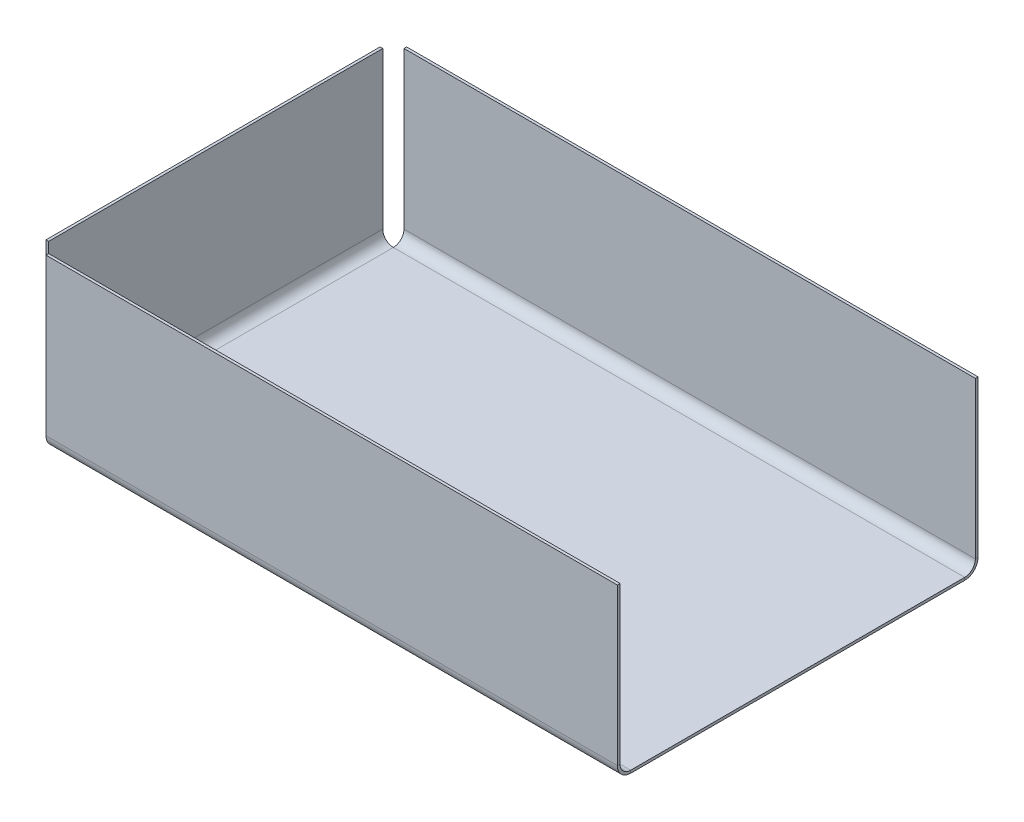
ISO-10303-21;
HEADER;
FILE_DESCRIPTION(('STEP AP214'),'2;1');
FILE_NAME('part.step','',(''),(''),'','','');
FILE_SCHEMA(('AUTOMOTIVE_DESIGN { 1 0 10303 214 1 1 1 1 }'));
ENDSEC;
DATA;
#1=APPLICATION_CONTEXT('core data for automotive mechanical design processes');
#2=APPLICATION_PROTOCOL_DEFINITION('international standard','automotive_design',2000,#1);
#3=PRODUCT_CONTEXT('',#1,'mechanical');
#4=PRODUCT('Part','Part','',(#3));
#5=PRODUCT_RELATED_PRODUCT_CATEGORY('part','',(#4));
#6=PRODUCT_DEFINITION_FORMATION('','',#4);
#7=PRODUCT_DEFINITION_CONTEXT('part definition',#1,'design');
#8=PRODUCT_DEFINITION('design','',#6,#7);
#9=PRODUCT_DEFINITION_SHAPE('','',#8);
#10=(LENGTH_UNIT() NAMED_UNIT(*) SI_UNIT(.MILLI.,.METRE.));
#11=(NAMED_UNIT(*) PLANE_ANGLE_UNIT() SI_UNIT($,.RADIAN.));
#12=(NAMED_UNIT(*) SI_UNIT($,.STERADIAN.) SOLID_ANGLE_UNIT());
#13=UNCERTAINTY_MEASURE_WITH_UNIT(LENGTH_MEASURE(1.E-05),#10,'distance_accuracy_value','');
#14=(GEOMETRIC_REPRESENTATION_CONTEXT(3) GLOBAL_UNCERTAINTY_ASSIGNED_CONTEXT((#13)) GLOBAL_UNIT_ASSIGNED_CONTEXT((#10,
#11,#12)) REPRESENTATION_CONTEXT('',''));
#15=CARTESIAN_POINT('',(0.,0.,0.));
#16=DIRECTION('',(0.,0.,1.));
#17=DIRECTION('',(1.,0.,0.));
#18=AXIS2_PLACEMENT_3D('',#15,#16,#17);
#19=CARTESIAN_POINT('',(0.,-1.6002,0.));
#20=DIRECTION('',(0.,1.,0.));
#21=DIRECTION('',(0.,0.,1.));
#22=AXIS2_PLACEMENT_3D('',#19,#20,#21);
#23=PLANE('',#22);
#24=DIRECTION('',(0.,0.,1.));
#25=VECTOR('',#24,1.);
#26=CARTESIAN_POINT('',(-167.0498,-1.6002,100.));
#27=LINE('',#26,#25);
#28=CARTESIAN_POINT('',(-167.0498,-1.6002,100.));
#29=VERTEX_POINT('',#28);
#30=CARTESIAN_POINT('',(-167.0498,-1.60020000000004,-100.));
#31=VERTEX_POINT('',#30);
#32=EDGE_CURVE('E212',#29,#31,#27,.F.);
#33=ORIENTED_EDGE('',*,*,#32,.T.);
#34=DIRECTION('',(-1.,0.,0.));
#35=VECTOR('',#34,1.);
#36=CARTESIAN_POINT('',(-175.,-1.6002,-100.));
#37=LINE('',#36,#35);
#38=CARTESIAN_POINT('',(175.,-1.6002,-100.));
#39=VERTEX_POINT('',#38);
#40=EDGE_CURVE('E130',#39,#31,#37,.T.);
#41=ORIENTED_EDGE('',*,*,#40,.F.);
#42=DIRECTION('',(0.,0.,-1.));
#43=VECTOR('',#42,1.);
#44=CARTESIAN_POINT('',(175.,-1.6002,-100.));
#45=LINE('',#44,#43);
#46=CARTESIAN_POINT('',(175.,-1.60020000000003,100.));
#47=VERTEX_POINT('',#46);
#48=EDGE_CURVE('E226',#47,#39,#45,.T.);
#49=ORIENTED_EDGE('',*,*,#48,.F.);
#50=DIRECTION('',(1.,0.,0.));
#51=VECTOR('',#50,1.);
#52=CARTESIAN_POINT('',(-175.,-1.6002,100.));
#53=LINE('',#52,#51);
#54=EDGE_CURVE('E149',#29,#47,#53,.T.);
#55=ORIENTED_EDGE('',*,*,#54,.F.);
#56=EDGE_LOOP('',(#33,#41,#49,#55));
#57=FACE_BOUND('',#56,.T.);
#58=ADVANCED_FACE('F106',(#57),#23,.F.);
#59=CARTESIAN_POINT('',(0.,0.,0.));
#60=DIRECTION('',(0.,1.,0.));
#61=DIRECTION('',(0.,0.,1.));
#62=AXIS2_PLACEMENT_3D('',#59,#60,#61);
#63=PLANE('',#62);
#64=DIRECTION('',(-1.,0.,0.));
#65=VECTOR('',#64,1.);
#66=CARTESIAN_POINT('',(-175.,0.,-100.));
#67=LINE('',#66,#65);
#68=CARTESIAN_POINT('',(175.,0.,-100.));
#69=VERTEX_POINT('',#68);
#70=CARTESIAN_POINT('',(-167.0498,0.,-100.));
#71=VERTEX_POINT('',#70);
#72=EDGE_CURVE('E144',#69,#71,#67,.T.);
#73=ORIENTED_EDGE('',*,*,#72,.T.);
#74=DIRECTION('',(0.,0.,1.));
#75=VECTOR('',#74,1.);
#76=CARTESIAN_POINT('',(-167.0498,0.,100.));
#77=LINE('',#76,#75);
#78=CARTESIAN_POINT('',(-167.0498,0.,100.));
#79=VERTEX_POINT('',#78);
#80=EDGE_CURVE('E121',#79,#71,#77,.F.);
#81=ORIENTED_EDGE('',*,*,#80,.F.);
#82=DIRECTION('',(1.,0.,0.));
#83=VECTOR('',#82,1.);
#84=CARTESIAN_POINT('',(-175.,0.,100.));
#85=LINE('',#84,#83);
#86=CARTESIAN_POINT('',(175.,0.,100.));
#87=VERTEX_POINT('',#86);
#88=EDGE_CURVE('E228',#79,#87,#85,.T.);
#89=ORIENTED_EDGE('',*,*,#88,.T.);
#90=DIRECTION('',(0.,0.,-1.));
#91=VECTOR('',#90,1.);
#92=CARTESIAN_POINT('',(175.,0.,-100.));
#93=LINE('',#92,#91);
#94=EDGE_CURVE('E224',#87,#69,#93,.T.);
#95=ORIENTED_EDGE('',*,*,#94,.T.);
#96=EDGE_LOOP('',(#73,#81,#89,#95));
#97=FACE_BOUND('',#96,.T.);
#98=ADVANCED_FACE('F233',(#97),#63,.T.);
#99=CARTESIAN_POINT('',(175.,-1.6002,-100.));
#100=DIRECTION('',(1.,0.,0.));
#101=DIRECTION('',(0.,0.,-1.));
#102=AXIS2_PLACEMENT_3D('',#99,#100,#101);
#103=PLANE('',#102);
#104=ORIENTED_EDGE('',*,*,#94,.F.);
#105=DIRECTION('',(0.,1.,0.));
#106=VECTOR('',#105,1.);
#107=CARTESIAN_POINT('',(175.,-1.6002,100.));
#108=LINE('',#107,#106);
#109=EDGE_CURVE('E13',#47,#87,#108,.T.);
#110=ORIENTED_EDGE('',*,*,#109,.F.);
#111=ORIENTED_EDGE('',*,*,#48,.T.);
#112=DIRECTION('',(0.,1.,0.));
#113=VECTOR('',#112,1.);
#114=CARTESIAN_POINT('',(175.,-1.6002,-100.));
#115=LINE('',#114,#113);
#116=EDGE_CURVE('E110',#39,#69,#115,.T.);
#117=ORIENTED_EDGE('',*,*,#116,.T.);
#118=EDGE_LOOP('',(#104,#110,#111,#117));
#119=FACE_BOUND('',#118,.T.);
#120=ADVANCED_FACE('F108',(#119),#103,.T.);
#121=CARTESIAN_POINT('',(-167.0498,6.34999999999999,-100.));
#122=DIRECTION('',(0.,0.,-1.));
#123=DIRECTION('',(-1.,0.,0.));
#124=AXIS2_PLACEMENT_3D('',#121,#122,#123);
#125=PLANE('',#124);
#126=DIRECTION('',(-1.,0.,0.));
#127=VECTOR('',#126,1.);
#128=CARTESIAN_POINT('',(-175.,6.34999999999997,-100.));
#129=LINE('',#128,#127);
#130=CARTESIAN_POINT('',(-173.3998,6.34999999999997,-100.));
#131=VERTEX_POINT('',#130);
#132=CARTESIAN_POINT('',(-175.,6.34999999999996,-100.));
#133=VERTEX_POINT('',#132);
#134=EDGE_CURVE('E176',#131,#133,#129,.T.);
#135=ORIENTED_EDGE('',*,*,#134,.F.);
#136=CARTESIAN_POINT('',(-167.0498,6.34999999999999,-100.));
#137=DIRECTION('',(0.,0.,1.));
#138=DIRECTION('',(1.,0.,0.));
#139=AXIS2_PLACEMENT_3D('',#136,#137,#138);
#140=CIRCLE('',#139,6.34999999999999);
#141=EDGE_CURVE('E170',#71,#131,#140,.F.);
#142=ORIENTED_EDGE('',*,*,#141,.F.);
#143=DIRECTION('',(0.,-1.,0.));
#144=VECTOR('',#143,1.);
#145=CARTESIAN_POINT('',(-167.0498,0.,-100.));
#146=LINE('',#145,#144);
#147=EDGE_CURVE('E221',#71,#31,#146,.T.);
#148=ORIENTED_EDGE('',*,*,#147,.T.);
#149=CARTESIAN_POINT('',(-167.0498,6.34999999999999,-100.));
#150=DIRECTION('',(0.,0.,1.));
#151=DIRECTION('',(1.,0.,0.));
#152=AXIS2_PLACEMENT_3D('',#149,#150,#151);
#153=CIRCLE('',#152,7.95019999999999);
#154=EDGE_CURVE('E214',#31,#133,#153,.F.);
#155=ORIENTED_EDGE('',*,*,#154,.T.);
#156=EDGE_LOOP('',(#135,#142,#148,#155));
#157=FACE_BOUND('',#156,.T.);
#158=ADVANCED_FACE('F465',(#157),#125,.T.);
#159=CARTESIAN_POINT('',(-167.0498,6.34999999999999,100.));
#160=DIRECTION('',(0.,0.,-1.));
#161=DIRECTION('',(-1.,0.,0.));
#162=AXIS2_PLACEMENT_3D('',#159,#160,#161);
#163=PLANE('',#162);
#164=CARTESIAN_POINT('',(-167.0498,6.34999999999999,100.));
#165=DIRECTION('',(0.,0.,1.));
#166=DIRECTION('',(1.,0.,0.));
#167=AXIS2_PLACEMENT_3D('',#164,#165,#166);
#168=CIRCLE('',#167,6.34999999999999);
#169=CARTESIAN_POINT('',(-173.3998,6.34999999999997,100.));
#170=VERTEX_POINT('',#169);
#171=EDGE_CURVE('E167',#170,#79,#168,.T.);
#172=ORIENTED_EDGE('',*,*,#171,.F.);
#173=DIRECTION('',(-1.,0.,0.));
#174=VECTOR('',#173,1.);
#175=CARTESIAN_POINT('',(-173.3998,6.34999999999997,100.));
#176=LINE('',#175,#174);
#177=CARTESIAN_POINT('',(-175.,6.34999999999996,100.));
#178=VERTEX_POINT('',#177);
#179=EDGE_CURVE('E175',#170,#178,#176,.T.);
#180=ORIENTED_EDGE('',*,*,#179,.T.);
#181=CARTESIAN_POINT('',(-167.0498,6.34999999999999,100.));
#182=DIRECTION('',(0.,0.,1.));
#183=DIRECTION('',(1.,0.,0.));
#184=AXIS2_PLACEMENT_3D('',#181,#182,#183);
#185=CIRCLE('',#184,7.95019999999999);
#186=EDGE_CURVE('E215',#178,#29,#185,.T.);
#187=ORIENTED_EDGE('',*,*,#186,.T.);
#188=DIRECTION('',(0.,-1.,0.));
#189=VECTOR('',#188,1.);
#190=CARTESIAN_POINT('',(-167.0498,0.,100.));
#191=LINE('',#190,#189);
#192=EDGE_CURVE('E185',#79,#29,#191,.T.);
#193=ORIENTED_EDGE('',*,*,#192,.F.);
#194=EDGE_LOOP('',(#172,#180,#187,#193));
#195=FACE_BOUND('',#194,.T.);
#196=ADVANCED_FACE('F180',(#195),#163,.F.);
#197=CARTESIAN_POINT('',(-167.0498,6.34999999999999,100.));
#198=DIRECTION('',(0.,0.,1.));
#199=DIRECTION('',(-1.,0.,0.));
#200=AXIS2_PLACEMENT_3D('',#197,#198,#199);
#201=CYLINDRICAL_SURFACE('',#200,7.95019999999999);
#202=ORIENTED_EDGE('',*,*,#32,.F.);
#203=ORIENTED_EDGE('',*,*,#186,.F.);
#204=DIRECTION('',(0.,0.,1.));
#205=VECTOR('',#204,1.);
#206=CARTESIAN_POINT('',(-175.,6.34999999999996,0.));
#207=LINE('',#206,#205);
#208=EDGE_CURVE('E203',#133,#178,#207,.T.);
#209=ORIENTED_EDGE('',*,*,#208,.F.);
#210=ORIENTED_EDGE('',*,*,#154,.F.);
#211=EDGE_LOOP('',(#202,#203,#209,#210));
#212=FACE_BOUND('',#211,.T.);
#213=ADVANCED_FACE('F464',(#212),#201,.T.);
#214=CARTESIAN_POINT('',(-167.0498,6.34999999999999,100.));
#215=DIRECTION('',(0.,0.,1.));
#216=DIRECTION('',(-1.,0.,0.));
#217=AXIS2_PLACEMENT_3D('',#214,#215,#216);
#218=CYLINDRICAL_SURFACE('',#217,6.34999999999999);
#219=ORIENTED_EDGE('',*,*,#80,.T.);
#220=ORIENTED_EDGE('',*,*,#141,.T.);
#221=DIRECTION('',(0.,0.,-1.));
#222=VECTOR('',#221,1.);
#223=CARTESIAN_POINT('',(-173.3998,6.34999999999997,-100.));
#224=LINE('',#223,#222);
#225=EDGE_CURVE('E164',#131,#170,#224,.F.);
#226=ORIENTED_EDGE('',*,*,#225,.T.);
#227=ORIENTED_EDGE('',*,*,#171,.T.);
#228=EDGE_LOOP('',(#219,#220,#226,#227));
#229=FACE_BOUND('',#228,.T.);
#230=ADVANCED_FACE('F166',(#229),#218,.F.);
#231=CARTESIAN_POINT('',(-175.,0.,100.));
#232=DIRECTION('',(0.,0.,1.));
#233=DIRECTION('',(1.,0.,0.));
#234=AXIS2_PLACEMENT_3D('',#231,#232,#233);
#235=PLANE('',#234);
#236=DIRECTION('',(0.,-1.,0.));
#237=VECTOR('',#236,1.);
#238=CARTESIAN_POINT('',(-175.,0.,100.));
#239=LINE('',#238,#237);
#240=CARTESIAN_POINT('',(-175.,100.,100.));
#241=VERTEX_POINT('',#240);
#242=EDGE_CURVE('E202',#241,#178,#239,.T.);
#243=ORIENTED_EDGE('',*,*,#242,.T.);
#244=ORIENTED_EDGE('',*,*,#179,.F.);
#245=DIRECTION('',(0.,1.,0.));
#246=VECTOR('',#245,1.);
#247=CARTESIAN_POINT('',(-173.3998,-6.31439345255558E-13,100.));
#248=LINE('',#247,#246);
#249=CARTESIAN_POINT('',(-173.3998,100.,100.));
#250=VERTEX_POINT('',#249);
#251=EDGE_CURVE('E190',#250,#170,#248,.F.);
#252=ORIENTED_EDGE('',*,*,#251,.F.);
#253=DIRECTION('',(1.,0.,0.));
#254=VECTOR('',#253,1.);
#255=CARTESIAN_POINT('',(-175.,100.,100.));
#256=LINE('',#255,#254);
#257=EDGE_CURVE('E186',#241,#250,#256,.T.);
#258=ORIENTED_EDGE('',*,*,#257,.F.);
#259=EDGE_LOOP('',(#243,#244,#252,#258));
#260=FACE_BOUND('',#259,.T.);
#261=ADVANCED_FACE('F200',(#260),#235,.T.);
#262=CARTESIAN_POINT('',(-175.,100.,-100.));
#263=DIRECTION('',(0.,0.,-1.));
#264=DIRECTION('',(-1.,0.,0.));
#265=AXIS2_PLACEMENT_3D('',#262,#263,#264);
#266=PLANE('',#265);
#267=DIRECTION('',(0.,-1.,0.));
#268=VECTOR('',#267,1.);
#269=CARTESIAN_POINT('',(-173.3998,-6.31439345255558E-13,-100.));
#270=LINE('',#269,#268);
#271=CARTESIAN_POINT('',(-173.3998,100.,-100.));
#272=VERTEX_POINT('',#271);
#273=EDGE_CURVE('E205',#131,#272,#270,.F.);
#274=ORIENTED_EDGE('',*,*,#273,.F.);
#275=ORIENTED_EDGE('',*,*,#134,.T.);
#276=DIRECTION('',(0.,1.,0.));
#277=VECTOR('',#276,1.);
#278=CARTESIAN_POINT('',(-175.,100.,-100.));
#279=LINE('',#278,#277);
#280=CARTESIAN_POINT('',(-175.,100.,-100.));
#281=VERTEX_POINT('',#280);
#282=EDGE_CURVE('E197',#133,#281,#279,.T.);
#283=ORIENTED_EDGE('',*,*,#282,.T.);
#284=DIRECTION('',(1.,0.,0.));
#285=VECTOR('',#284,1.);
#286=CARTESIAN_POINT('',(-175.,100.,-100.));
#287=LINE('',#286,#285);
#288=EDGE_CURVE('E265',#281,#272,#287,.T.);
#289=ORIENTED_EDGE('',*,*,#288,.T.);
#290=EDGE_LOOP('',(#274,#275,#283,#289));
#291=FACE_BOUND('',#290,.T.);
#292=ADVANCED_FACE('F277',(#291),#266,.T.);
#293=CARTESIAN_POINT('',(-175.,-6.37026413693975E-13,0.));
#294=DIRECTION('',(-1.,0.,0.));
#295=DIRECTION('',(0.,-1.,0.));
#296=AXIS2_PLACEMENT_3D('',#293,#294,#295);
#297=PLANE('',#296);
#298=ORIENTED_EDGE('',*,*,#282,.F.);
#299=ORIENTED_EDGE('',*,*,#208,.T.);
#300=ORIENTED_EDGE('',*,*,#242,.F.);
#301=DIRECTION('',(0.,0.,1.));
#302=VECTOR('',#301,1.);
#303=CARTESIAN_POINT('',(-175.,100.,100.));
#304=LINE('',#303,#302);
#305=EDGE_CURVE('E269',#281,#241,#304,.T.);
#306=ORIENTED_EDGE('',*,*,#305,.F.);
#307=EDGE_LOOP('',(#298,#299,#300,#306));
#308=FACE_BOUND('',#307,.T.);
#309=ADVANCED_FACE('F476',(#308),#297,.T.);
#310=CARTESIAN_POINT('',(-173.3998,-6.31439345255558E-13,0.));
#311=DIRECTION('',(-1.,0.,0.));
#312=DIRECTION('',(0.,-1.,0.));
#313=AXIS2_PLACEMENT_3D('',#310,#311,#312);
#314=PLANE('',#313);
#315=ORIENTED_EDGE('',*,*,#225,.F.);
#316=ORIENTED_EDGE('',*,*,#273,.T.);
#317=DIRECTION('',(0.,0.,-1.));
#318=VECTOR('',#317,1.);
#319=CARTESIAN_POINT('',(-173.3998,100.,0.));
#320=LINE('',#319,#318);
#321=EDGE_CURVE('E194',#272,#250,#320,.F.);
#322=ORIENTED_EDGE('',*,*,#321,.T.);
#323=ORIENTED_EDGE('',*,*,#251,.T.);
#324=EDGE_LOOP('',(#315,#316,#322,#323));
#325=FACE_BOUND('',#324,.T.);
#326=ADVANCED_FACE('F191',(#325),#314,.F.);
#327=CARTESIAN_POINT('',(-175.,100.,100.));
#328=DIRECTION('',(0.,1.,0.));
#329=DIRECTION('',(-1.,0.,0.));
#330=AXIS2_PLACEMENT_3D('',#327,#328,#329);
#331=PLANE('',#330);
#332=ORIENTED_EDGE('',*,*,#321,.F.);
#333=ORIENTED_EDGE('',*,*,#288,.F.);
#334=ORIENTED_EDGE('',*,*,#305,.T.);
#335=ORIENTED_EDGE('',*,*,#257,.T.);
#336=EDGE_LOOP('',(#332,#333,#334,#335));
#337=FACE_BOUND('',#336,.T.);
#338=ADVANCED_FACE('F282',(#337),#331,.T.);
#339=CARTESIAN_POINT('',(-167.0498,6.34999999999998,100.));
#340=DIRECTION('',(-1.,0.,0.));
#341=DIRECTION('',(0.,0.,1.));
#342=AXIS2_PLACEMENT_3D('',#339,#340,#341);
#343=PLANE('',#342);
#344=DIRECTION('',(0.,0.,1.));
#345=VECTOR('',#344,1.);
#346=CARTESIAN_POINT('',(-167.0498,6.34999999999998,107.9502));
#347=LINE('',#346,#345);
#348=CARTESIAN_POINT('',(-167.0498,6.34999999999996,106.35));
#349=VERTEX_POINT('',#348);
#350=CARTESIAN_POINT('',(-167.0498,6.34999999999995,107.9502));
#351=VERTEX_POINT('',#350);
#352=EDGE_CURVE('E387',#349,#351,#347,.T.);
#353=ORIENTED_EDGE('',*,*,#352,.F.);
#354=CARTESIAN_POINT('',(-167.0498,6.34999999999998,100.));
#355=DIRECTION('',(1.,0.,0.));
#356=DIRECTION('',(0.,0.,-1.));
#357=AXIS2_PLACEMENT_3D('',#354,#355,#356);
#358=CIRCLE('',#357,6.35000000000001);
#359=EDGE_CURVE('E254',#79,#349,#358,.F.);
#360=ORIENTED_EDGE('',*,*,#359,.F.);
#361=ORIENTED_EDGE('',*,*,#192,.T.);
#362=CARTESIAN_POINT('',(-167.0498,6.34999999999998,100.));
#363=DIRECTION('',(1.,0.,0.));
#364=DIRECTION('',(0.,0.,-1.));
#365=AXIS2_PLACEMENT_3D('',#362,#363,#364);
#366=CIRCLE('',#365,7.95020000000001);
#367=EDGE_CURVE('E211',#29,#351,#366,.F.);
#368=ORIENTED_EDGE('',*,*,#367,.T.);
#369=EDGE_LOOP('',(#353,#360,#361,#368));
#370=FACE_BOUND('',#369,.T.);
#371=ADVANCED_FACE('F424',(#370),#343,.T.);
#372=CARTESIAN_POINT('',(175.,6.34999999999998,100.));
#373=DIRECTION('',(-1.,0.,0.));
#374=DIRECTION('',(0.,0.,1.));
#375=AXIS2_PLACEMENT_3D('',#372,#373,#374);
#376=PLANE('',#375);
#377=CARTESIAN_POINT('',(175.,6.34999999999998,100.));
#378=DIRECTION('',(1.,0.,0.));
#379=DIRECTION('',(0.,0.,-1.));
#380=AXIS2_PLACEMENT_3D('',#377,#378,#379);
#381=CIRCLE('',#380,6.35000000000001);
#382=CARTESIAN_POINT('',(175.,6.34999999999996,106.35));
#383=VERTEX_POINT('',#382);
#384=EDGE_CURVE('E246',#383,#87,#381,.T.);
#385=ORIENTED_EDGE('',*,*,#384,.F.);
#386=DIRECTION('',(0.,0.,1.));
#387=VECTOR('',#386,1.);
#388=CARTESIAN_POINT('',(175.,6.34999999999998,106.35));
#389=LINE('',#388,#387);
#390=CARTESIAN_POINT('',(175.,6.34999999999998,107.9502));
#391=VERTEX_POINT('',#390);
#392=EDGE_CURVE('E416',#383,#391,#389,.T.);
#393=ORIENTED_EDGE('',*,*,#392,.T.);
#394=CARTESIAN_POINT('',(175.,6.34999999999998,100.));
#395=DIRECTION('',(1.,0.,0.));
#396=DIRECTION('',(0.,0.,-1.));
#397=AXIS2_PLACEMENT_3D('',#394,#395,#396);
#398=CIRCLE('',#397,7.95020000000001);
#399=EDGE_CURVE('E249',#391,#47,#398,.T.);
#400=ORIENTED_EDGE('',*,*,#399,.T.);
#401=ORIENTED_EDGE('',*,*,#109,.T.);
#402=EDGE_LOOP('',(#385,#393,#400,#401));
#403=FACE_BOUND('',#402,.T.);
#404=ADVANCED_FACE('F243',(#403),#376,.F.);
#405=CARTESIAN_POINT('',(175.,6.34999999999998,100.));
#406=DIRECTION('',(1.,0.,0.));
#407=DIRECTION('',(0.,0.,1.));
#408=AXIS2_PLACEMENT_3D('',#405,#406,#407);
#409=CYLINDRICAL_SURFACE('',#408,7.95020000000001);
#410=ORIENTED_EDGE('',*,*,#54,.T.);
#411=ORIENTED_EDGE('',*,*,#399,.F.);
#412=DIRECTION('',(1.,0.,0.));
#413=VECTOR('',#412,1.);
#414=CARTESIAN_POINT('',(0.,6.34999999999998,107.9502));
#415=LINE('',#414,#413);
#416=EDGE_CURVE('E413',#351,#391,#415,.T.);
#417=ORIENTED_EDGE('',*,*,#416,.F.);
#418=ORIENTED_EDGE('',*,*,#367,.F.);
#419=EDGE_LOOP('',(#410,#411,#417,#418));
#420=FACE_BOUND('',#419,.T.);
#421=ADVANCED_FACE('F451',(#420),#409,.T.);
#422=CARTESIAN_POINT('',(175.,6.34999999999998,100.));
#423=DIRECTION('',(1.,0.,0.));
#424=DIRECTION('',(0.,0.,1.));
#425=AXIS2_PLACEMENT_3D('',#422,#423,#424);
#426=CYLINDRICAL_SURFACE('',#425,6.35000000000001);
#427=ORIENTED_EDGE('',*,*,#88,.F.);
#428=ORIENTED_EDGE('',*,*,#359,.T.);
#429=DIRECTION('',(-1.,0.,0.));
#430=VECTOR('',#429,1.);
#431=CARTESIAN_POINT('',(-167.0498,6.34999999999998,106.35));
#432=LINE('',#431,#430);
#433=EDGE_CURVE('E253',#349,#383,#432,.F.);
#434=ORIENTED_EDGE('',*,*,#433,.T.);
#435=ORIENTED_EDGE('',*,*,#384,.T.);
#436=EDGE_LOOP('',(#427,#428,#434,#435));
#437=FACE_BOUND('',#436,.T.);
#438=ADVANCED_FACE('F251',(#437),#426,.F.);
#439=CARTESIAN_POINT('',(175.,0.,107.9502));
#440=DIRECTION('',(1.,0.,0.));
#441=DIRECTION('',(0.,0.,-1.));
#442=AXIS2_PLACEMENT_3D('',#439,#440,#441);
#443=PLANE('',#442);
#444=DIRECTION('',(0.,-1.,0.));
#445=VECTOR('',#444,1.);
#446=CARTESIAN_POINT('',(175.,0.,107.9502));
#447=LINE('',#446,#445);
#448=CARTESIAN_POINT('',(175.,100.,107.9502));
#449=VERTEX_POINT('',#448);
#450=EDGE_CURVE('E398',#449,#391,#447,.T.);
#451=ORIENTED_EDGE('',*,*,#450,.T.);
#452=ORIENTED_EDGE('',*,*,#392,.F.);
#453=DIRECTION('',(0.,1.,0.));
#454=VECTOR('',#453,1.);
#455=CARTESIAN_POINT('',(175.,-3.46944695195361E-13,106.35));
#456=LINE('',#455,#454);
#457=CARTESIAN_POINT('',(175.,100.,106.35));
#458=VERTEX_POINT('',#457);
#459=EDGE_CURVE('E406',#458,#383,#456,.F.);
#460=ORIENTED_EDGE('',*,*,#459,.F.);
#461=DIRECTION('',(0.,0.,-1.));
#462=VECTOR('',#461,1.);
#463=CARTESIAN_POINT('',(175.,100.,107.9502));
#464=LINE('',#463,#462);
#465=EDGE_CURVE('E255',#449,#458,#464,.T.);
#466=ORIENTED_EDGE('',*,*,#465,.F.);
#467=EDGE_LOOP('',(#451,#452,#460,#466));
#468=FACE_BOUND('',#467,.T.);
#469=ADVANCED_FACE('F443',(#468),#443,.T.);
#470=CARTESIAN_POINT('',(-167.0498,100.,107.9502));
#471=DIRECTION('',(-1.,0.,0.));
#472=DIRECTION('',(0.,0.,1.));
#473=AXIS2_PLACEMENT_3D('',#470,#471,#472);
#474=PLANE('',#473);
#475=DIRECTION('',(0.,-1.,0.));
#476=VECTOR('',#475,1.);
#477=CARTESIAN_POINT('',(-167.0498,-3.46944695195361E-13,106.35));
#478=LINE('',#477,#476);
#479=CARTESIAN_POINT('',(-167.0498,100.,106.35));
#480=VERTEX_POINT('',#479);
#481=EDGE_CURVE('E411',#349,#480,#478,.F.);
#482=ORIENTED_EDGE('',*,*,#481,.F.);
#483=ORIENTED_EDGE('',*,*,#352,.T.);
#484=DIRECTION('',(0.,1.,0.));
#485=VECTOR('',#484,1.);
#486=CARTESIAN_POINT('',(-167.0498,100.,107.9502));
#487=LINE('',#486,#485);
#488=CARTESIAN_POINT('',(-167.0498,100.,107.9502));
#489=VERTEX_POINT('',#488);
#490=EDGE_CURVE('E404',#351,#489,#487,.T.);
#491=ORIENTED_EDGE('',*,*,#490,.T.);
#492=DIRECTION('',(0.,0.,-1.));
#493=VECTOR('',#492,1.);
#494=CARTESIAN_POINT('',(-167.0498,100.,107.9502));
#495=LINE('',#494,#493);
#496=EDGE_CURVE('E259',#489,#480,#495,.T.);
#497=ORIENTED_EDGE('',*,*,#496,.T.);
#498=EDGE_LOOP('',(#482,#483,#491,#497));
#499=FACE_BOUND('',#498,.T.);
#500=ADVANCED_FACE('F429',(#499),#474,.T.);
#501=CARTESIAN_POINT('',(0.,-3.52531763633778E-13,107.9502));
#502=DIRECTION('',(0.,0.,1.));
#503=DIRECTION('',(0.,-1.,0.));
#504=AXIS2_PLACEMENT_3D('',#501,#502,#503);
#505=PLANE('',#504);
#506=ORIENTED_EDGE('',*,*,#490,.F.);
#507=ORIENTED_EDGE('',*,*,#416,.T.);
#508=ORIENTED_EDGE('',*,*,#450,.F.);
#509=DIRECTION('',(1.,0.,0.));
#510=VECTOR('',#509,1.);
#511=CARTESIAN_POINT('',(175.,100.,107.9502));
#512=LINE('',#511,#510);
#513=EDGE_CURVE('E401',#489,#449,#512,.T.);
#514=ORIENTED_EDGE('',*,*,#513,.F.);
#515=EDGE_LOOP('',(#506,#507,#508,#514));
#516=FACE_BOUND('',#515,.T.);
#517=ADVANCED_FACE('F433',(#516),#505,.T.);
#518=CARTESIAN_POINT('',(0.,-3.46944695195361E-13,106.35));
#519=DIRECTION('',(0.,0.,1.));
#520=DIRECTION('',(0.,-1.,0.));
#521=AXIS2_PLACEMENT_3D('',#518,#519,#520);
#522=PLANE('',#521);
#523=ORIENTED_EDGE('',*,*,#433,.F.);
#524=ORIENTED_EDGE('',*,*,#481,.T.);
#525=DIRECTION('',(-1.,0.,0.));
#526=VECTOR('',#525,1.);
#527=CARTESIAN_POINT('',(0.,100.,106.35));
#528=LINE('',#527,#526);
#529=EDGE_CURVE('E408',#480,#458,#528,.F.);
#530=ORIENTED_EDGE('',*,*,#529,.T.);
#531=ORIENTED_EDGE('',*,*,#459,.T.);
#532=EDGE_LOOP('',(#523,#524,#530,#531));
#533=FACE_BOUND('',#532,.T.);
#534=ADVANCED_FACE('F440',(#533),#522,.F.);
#535=CARTESIAN_POINT('',(175.,100.,107.9502));
#536=DIRECTION('',(0.,1.,0.));
#537=DIRECTION('',(0.,0.,1.));
#538=AXIS2_PLACEMENT_3D('',#535,#536,#537);
#539=PLANE('',#538);
#540=ORIENTED_EDGE('',*,*,#529,.F.);
#541=ORIENTED_EDGE('',*,*,#496,.F.);
#542=ORIENTED_EDGE('',*,*,#513,.T.);
#543=ORIENTED_EDGE('',*,*,#465,.T.);
#544=EDGE_LOOP('',(#540,#541,#542,#543));
#545=FACE_BOUND('',#544,.T.);
#546=ADVANCED_FACE('F437',(#545),#539,.T.);
#547=CARTESIAN_POINT('',(175.,6.34999999999994,-100.));
#548=DIRECTION('',(1.,0.,0.));
#549=DIRECTION('',(0.,0.,-1.));
#550=AXIS2_PLACEMENT_3D('',#547,#548,#549);
#551=PLANE('',#550);
#552=DIRECTION('',(0.,0.,-1.));
#553=VECTOR('',#552,1.);
#554=CARTESIAN_POINT('',(175.,6.34999999999999,-107.9502));
#555=LINE('',#554,#553);
#556=CARTESIAN_POINT('',(175.,6.34999999999994,-106.35));
#557=VERTEX_POINT('',#556);
#558=CARTESIAN_POINT('',(175.,6.34999999999994,-107.9502));
#559=VERTEX_POINT('',#558);
#560=EDGE_CURVE('E381',#557,#559,#555,.T.);
#561=ORIENTED_EDGE('',*,*,#560,.F.);
#562=CARTESIAN_POINT('',(175.,6.34999999999994,-100.));
#563=DIRECTION('',(-1.,0.,0.));
#564=DIRECTION('',(0.,0.,1.));
#565=AXIS2_PLACEMENT_3D('',#562,#563,#564);
#566=CIRCLE('',#565,6.34999999999998);
#567=EDGE_CURVE('E391',#69,#557,#566,.F.);
#568=ORIENTED_EDGE('',*,*,#567,.F.);
#569=ORIENTED_EDGE('',*,*,#116,.F.);
#570=CARTESIAN_POINT('',(175.,6.34999999999994,-100.));
#571=DIRECTION('',(-1.,0.,0.));
#572=DIRECTION('',(0.,0.,1.));
#573=AXIS2_PLACEMENT_3D('',#570,#571,#572);
#574=CIRCLE('',#573,7.95019999999998);
#575=EDGE_CURVE('E384',#39,#559,#574,.F.);
#576=ORIENTED_EDGE('',*,*,#575,.T.);
#577=EDGE_LOOP('',(#561,#568,#569,#576));
#578=FACE_BOUND('',#577,.T.);
#579=ADVANCED_FACE('F491',(#578),#551,.T.);
#580=CARTESIAN_POINT('',(-167.0498,6.34999999999994,-100.));
#581=DIRECTION('',(1.,0.,0.));
#582=DIRECTION('',(0.,0.,-1.));
#583=AXIS2_PLACEMENT_3D('',#580,#581,#582);
#584=PLANE('',#583);
#585=CARTESIAN_POINT('',(-167.0498,6.34999999999994,-100.));
#586=DIRECTION('',(-1.,0.,0.));
#587=DIRECTION('',(0.,0.,1.));
#588=AXIS2_PLACEMENT_3D('',#585,#586,#587);
#589=CIRCLE('',#588,6.34999999999998);
#590=CARTESIAN_POINT('',(-167.0498,6.34999999999994,-106.35));
#591=VERTEX_POINT('',#590);
#592=EDGE_CURVE('E351',#591,#71,#589,.T.);
#593=ORIENTED_EDGE('',*,*,#592,.F.);
#594=DIRECTION('',(0.,0.,-1.));
#595=VECTOR('',#594,1.);
#596=CARTESIAN_POINT('',(-167.0498,6.34999999999998,-106.35));
#597=LINE('',#596,#595);
#598=CARTESIAN_POINT('',(-167.0498,6.34999999999999,-107.9502));
#599=VERTEX_POINT('',#598);
#600=EDGE_CURVE('E376',#591,#599,#597,.T.);
#601=ORIENTED_EDGE('',*,*,#600,.T.);
#602=CARTESIAN_POINT('',(-167.0498,6.34999999999994,-100.));
#603=DIRECTION('',(-1.,0.,0.));
#604=DIRECTION('',(0.,0.,1.));
#605=AXIS2_PLACEMENT_3D('',#602,#603,#604);
#606=CIRCLE('',#605,7.95019999999998);
#607=EDGE_CURVE('E388',#599,#31,#606,.T.);
#608=ORIENTED_EDGE('',*,*,#607,.T.);
#609=ORIENTED_EDGE('',*,*,#147,.F.);
#610=EDGE_LOOP('',(#593,#601,#608,#609));
#611=FACE_BOUND('',#610,.T.);
#612=ADVANCED_FACE('F496',(#611),#584,.F.);
#613=CARTESIAN_POINT('',(-167.0498,6.34999999999994,-100.));
#614=DIRECTION('',(-1.,0.,0.));
#615=DIRECTION('',(0.,0.,-1.));
#616=AXIS2_PLACEMENT_3D('',#613,#614,#615);
#617=CYLINDRICAL_SURFACE('',#616,7.95019999999998);
#618=ORIENTED_EDGE('',*,*,#40,.T.);
#619=ORIENTED_EDGE('',*,*,#607,.F.);
#620=DIRECTION('',(-1.,0.,0.));
#621=VECTOR('',#620,1.);
#622=CARTESIAN_POINT('',(175.,6.34999999999999,-107.9502));
#623=LINE('',#622,#621);
#624=EDGE_CURVE('E360',#599,#559,#623,.F.);
#625=ORIENTED_EDGE('',*,*,#624,.T.);
#626=ORIENTED_EDGE('',*,*,#575,.F.);
#627=EDGE_LOOP('',(#618,#619,#625,#626));
#628=FACE_BOUND('',#627,.T.);
#629=ADVANCED_FACE('F505',(#628),#617,.T.);
#630=CARTESIAN_POINT('',(-167.0498,6.34999999999994,-100.));
#631=DIRECTION('',(-1.,0.,0.));
#632=DIRECTION('',(0.,0.,-1.));
#633=AXIS2_PLACEMENT_3D('',#630,#631,#632);
#634=CYLINDRICAL_SURFACE('',#633,6.34999999999998);
#635=ORIENTED_EDGE('',*,*,#72,.F.);
#636=ORIENTED_EDGE('',*,*,#567,.T.);
#637=DIRECTION('',(-1.,0.,0.));
#638=VECTOR('',#637,1.);
#639=CARTESIAN_POINT('',(175.,6.34999999999998,-106.35));
#640=LINE('',#639,#638);
#641=EDGE_CURVE('E379',#557,#591,#640,.T.);
#642=ORIENTED_EDGE('',*,*,#641,.T.);
#643=ORIENTED_EDGE('',*,*,#592,.T.);
#644=EDGE_LOOP('',(#635,#636,#642,#643));
#645=FACE_BOUND('',#644,.T.);
#646=ADVANCED_FACE('F508',(#645),#634,.F.);
#647=CARTESIAN_POINT('',(175.,0.,-107.9502));
#648=DIRECTION('',(1.,0.,0.));
#649=DIRECTION('',(0.,0.,-1.));
#650=AXIS2_PLACEMENT_3D('',#647,#648,#649);
#651=PLANE('',#650);
#652=DIRECTION('',(0.,1.,0.));
#653=VECTOR('',#652,1.);
#654=CARTESIAN_POINT('',(175.,0.,-106.35));
#655=LINE('',#654,#653);
#656=CARTESIAN_POINT('',(175.,100.,-106.35));
#657=VERTEX_POINT('',#656);
#658=EDGE_CURVE('E373',#557,#657,#655,.T.);
#659=ORIENTED_EDGE('',*,*,#658,.F.);
#660=ORIENTED_EDGE('',*,*,#560,.T.);
#661=DIRECTION('',(0.,-1.,0.));
#662=VECTOR('',#661,1.);
#663=CARTESIAN_POINT('',(175.,0.,-107.9502));
#664=LINE('',#663,#662);
#665=CARTESIAN_POINT('',(175.,100.,-107.9502));
#666=VERTEX_POINT('',#665);
#667=EDGE_CURVE('E365',#559,#666,#664,.F.);
#668=ORIENTED_EDGE('',*,*,#667,.T.);
#669=DIRECTION('',(0.,0.,1.));
#670=VECTOR('',#669,1.);
#671=CARTESIAN_POINT('',(175.,100.,-107.9502));
#672=LINE('',#671,#670);
#673=EDGE_CURVE('E352',#666,#657,#672,.T.);
#674=ORIENTED_EDGE('',*,*,#673,.T.);
#675=EDGE_LOOP('',(#659,#660,#668,#674));
#676=FACE_BOUND('',#675,.T.);
#677=ADVANCED_FACE('F511',(#676),#651,.T.);
#678=CARTESIAN_POINT('',(-167.0498,100.,-107.9502));
#679=DIRECTION('',(-1.,0.,0.));
#680=DIRECTION('',(0.,0.,1.));
#681=AXIS2_PLACEMENT_3D('',#678,#679,#680);
#682=PLANE('',#681);
#683=DIRECTION('',(0.,1.,0.));
#684=VECTOR('',#683,1.);
#685=CARTESIAN_POINT('',(-167.0498,100.,-107.9502));
#686=LINE('',#685,#684);
#687=CARTESIAN_POINT('',(-167.0498,100.,-107.9502));
#688=VERTEX_POINT('',#687);
#689=EDGE_CURVE('E344',#688,#599,#686,.F.);
#690=ORIENTED_EDGE('',*,*,#689,.T.);
#691=ORIENTED_EDGE('',*,*,#600,.F.);
#692=DIRECTION('',(0.,-1.,0.));
#693=VECTOR('',#692,1.);
#694=CARTESIAN_POINT('',(-167.0498,0.,-106.35));
#695=LINE('',#694,#693);
#696=CARTESIAN_POINT('',(-167.0498,100.,-106.35));
#697=VERTEX_POINT('',#696);
#698=EDGE_CURVE('E346',#697,#591,#695,.T.);
#699=ORIENTED_EDGE('',*,*,#698,.F.);
#700=DIRECTION('',(0.,0.,1.));
#701=VECTOR('',#700,1.);
#702=CARTESIAN_POINT('',(-167.0498,100.,-107.9502));
#703=LINE('',#702,#701);
#704=EDGE_CURVE('E340',#688,#697,#703,.T.);
#705=ORIENTED_EDGE('',*,*,#704,.F.);
#706=EDGE_LOOP('',(#690,#691,#699,#705));
#707=FACE_BOUND('',#706,.T.);
#708=ADVANCED_FACE('F342',(#707),#682,.T.);
#709=CARTESIAN_POINT('',(0.,0.,-107.9502));
#710=DIRECTION('',(0.,0.,1.));
#711=DIRECTION('',(1.,0.,0.));
#712=AXIS2_PLACEMENT_3D('',#709,#710,#711);
#713=PLANE('',#712);
#714=ORIENTED_EDGE('',*,*,#624,.F.);
#715=ORIENTED_EDGE('',*,*,#689,.F.);
#716=DIRECTION('',(1.,0.,0.));
#717=VECTOR('',#716,1.);
#718=CARTESIAN_POINT('',(175.,100.,-107.9502));
#719=LINE('',#718,#717);
#720=EDGE_CURVE('E359',#666,#688,#719,.F.);
#721=ORIENTED_EDGE('',*,*,#720,.F.);
#722=ORIENTED_EDGE('',*,*,#667,.F.);
#723=EDGE_LOOP('',(#714,#715,#721,#722));
#724=FACE_BOUND('',#723,.T.);
#725=ADVANCED_FACE('F357',(#724),#713,.F.);
#726=CARTESIAN_POINT('',(0.,0.,-106.35));
#727=DIRECTION('',(0.,0.,1.));
#728=DIRECTION('',(1.,0.,0.));
#729=AXIS2_PLACEMENT_3D('',#726,#727,#728);
#730=PLANE('',#729);
#731=ORIENTED_EDGE('',*,*,#698,.T.);
#732=ORIENTED_EDGE('',*,*,#641,.F.);
#733=ORIENTED_EDGE('',*,*,#658,.T.);
#734=DIRECTION('',(-1.,0.,0.));
#735=VECTOR('',#734,1.);
#736=CARTESIAN_POINT('',(0.,100.,-106.35));
#737=LINE('',#736,#735);
#738=EDGE_CURVE('E371',#657,#697,#737,.T.);
#739=ORIENTED_EDGE('',*,*,#738,.T.);
#740=EDGE_LOOP('',(#731,#732,#733,#739));
#741=FACE_BOUND('',#740,.T.);
#742=ADVANCED_FACE('F521',(#741),#730,.T.);
#743=CARTESIAN_POINT('',(175.,100.,-107.9502));
#744=DIRECTION('',(0.,1.,0.));
#745=DIRECTION('',(-1.,0.,0.));
#746=AXIS2_PLACEMENT_3D('',#743,#744,#745);
#747=PLANE('',#746);
#748=ORIENTED_EDGE('',*,*,#738,.F.);
#749=ORIENTED_EDGE('',*,*,#673,.F.);
#750=ORIENTED_EDGE('',*,*,#720,.T.);
#751=ORIENTED_EDGE('',*,*,#704,.T.);
#752=EDGE_LOOP('',(#748,#749,#750,#751));
#753=FACE_BOUND('',#752,.T.);
#754=ADVANCED_FACE('F363',(#753),#747,.T.);
#755=CLOSED_SHELL('',(#58,#98,#120,#158,#196,#213,#230,#261,#292,#309,#326,#338,#371,#404,#421,
#438,#469,#500,#517,#534,#546,#579,#612,#629,#646,#677,#708,#725,#742,#754));
#756=MANIFOLD_SOLID_BREP('B2',#755);
#757=ADVANCED_BREP_SHAPE_REPRESENTATION('',(#18,#756),#14);
#758=SHAPE_DEFINITION_REPRESENTATION(#9,#757);
ENDSEC;
END-ISO-10303-21;
